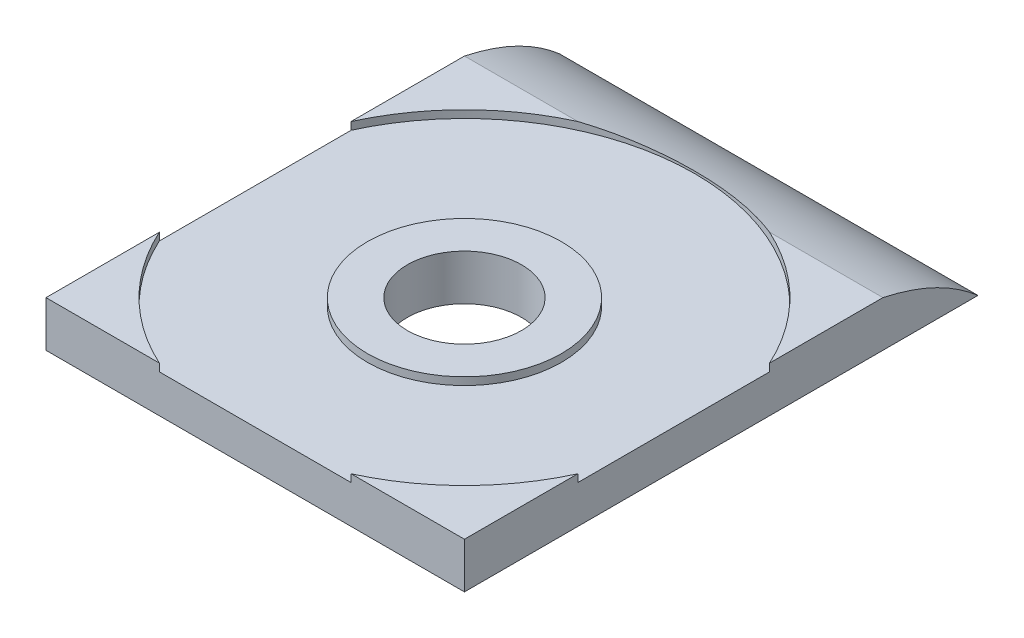
ISO-10303-21;
HEADER;
FILE_DESCRIPTION(('STEP AP214'),'2;1');
FILE_NAME('part.step','',(''),(''),'','','');
FILE_SCHEMA(('AUTOMOTIVE_DESIGN { 1 0 10303 214 1 1 1 1 }'));
ENDSEC;
DATA;
#1=APPLICATION_CONTEXT('core data for automotive mechanical design processes');
#2=APPLICATION_PROTOCOL_DEFINITION('international standard','automotive_design',2000,#1);
#3=PRODUCT_CONTEXT('',#1,'mechanical');
#4=PRODUCT('Part','Part','',(#3));
#5=PRODUCT_RELATED_PRODUCT_CATEGORY('part','',(#4));
#6=PRODUCT_DEFINITION_FORMATION('','',#4);
#7=PRODUCT_DEFINITION_CONTEXT('part definition',#1,'design');
#8=PRODUCT_DEFINITION('design','',#6,#7);
#9=PRODUCT_DEFINITION_SHAPE('','',#8);
#10=(LENGTH_UNIT() NAMED_UNIT(*) SI_UNIT(.MILLI.,.METRE.));
#11=(NAMED_UNIT(*) PLANE_ANGLE_UNIT() SI_UNIT($,.RADIAN.));
#12=(NAMED_UNIT(*) SI_UNIT($,.STERADIAN.) SOLID_ANGLE_UNIT());
#13=UNCERTAINTY_MEASURE_WITH_UNIT(LENGTH_MEASURE(1.E-05),#10,'distance_accuracy_value','');
#14=(GEOMETRIC_REPRESENTATION_CONTEXT(3) GLOBAL_UNCERTAINTY_ASSIGNED_CONTEXT((#13)) GLOBAL_UNIT_ASSIGNED_CONTEXT((#10,
#11,#12)) REPRESENTATION_CONTEXT('',''));
#15=CARTESIAN_POINT('',(0.,0.,0.));
#16=DIRECTION('',(0.,0.,1.));
#17=DIRECTION('',(1.,0.,0.));
#18=AXIS2_PLACEMENT_3D('',#15,#16,#17);
#19=CARTESIAN_POINT('',(0.,1.2,0.));
#20=DIRECTION('',(0.,1.,0.));
#21=DIRECTION('',(0.,0.,1.));
#22=AXIS2_PLACEMENT_3D('',#19,#20,#21);
#23=PLANE('',#22);
#24=CARTESIAN_POINT('',(0.,1.2,0.));
#25=DIRECTION('',(0.,1.,0.));
#26=DIRECTION('',(0.,0.,1.));
#27=AXIS2_PLACEMENT_3D('',#24,#25,#26);
#28=CIRCLE('',#27,6.05);
#29=CARTESIAN_POINT('',(2.52041663222571,1.2,5.5));
#30=VERTEX_POINT('',#29);
#31=CARTESIAN_POINT('',(5.5,1.2,2.52041663222571));
#32=VERTEX_POINT('',#31);
#33=EDGE_CURVE('E188',#30,#32,#28,.T.);
#34=ORIENTED_EDGE('',*,*,#33,.F.);
#35=DIRECTION('',(1.,0.,0.));
#36=VECTOR('',#35,1.);
#37=CARTESIAN_POINT('',(0.,1.2,5.5));
#38=LINE('',#37,#36);
#39=CARTESIAN_POINT('',(5.5,1.2,5.5));
#40=VERTEX_POINT('',#39);
#41=EDGE_CURVE('E112',#30,#40,#38,.T.);
#42=ORIENTED_EDGE('',*,*,#41,.T.);
#43=DIRECTION('',(0.,0.,1.));
#44=VECTOR('',#43,1.);
#45=CARTESIAN_POINT('',(5.5,1.2,0.));
#46=LINE('',#45,#44);
#47=EDGE_CURVE('E230',#32,#40,#46,.T.);
#48=ORIENTED_EDGE('',*,*,#47,.F.);
#49=EDGE_LOOP('',(#34,#42,#48));
#50=FACE_BOUND('',#49,.T.);
#51=ADVANCED_FACE('F35',(#50),#23,.T.);
#52=CARTESIAN_POINT('',(5.5,1.2,-2.52041663222571));
#53=VERTEX_POINT('',#52);
#54=CARTESIAN_POINT('',(2.52041663222571,1.2,-5.5));
#55=VERTEX_POINT('',#54);
#56=EDGE_CURVE('E50',#53,#55,#28,.T.);
#57=ORIENTED_EDGE('',*,*,#56,.F.);
#58=CARTESIAN_POINT('',(5.5,1.2,-5.5));
#59=VERTEX_POINT('',#58);
#60=EDGE_CURVE('E231',#59,#53,#46,.T.);
#61=ORIENTED_EDGE('',*,*,#60,.F.);
#62=DIRECTION('',(1.,0.,0.));
#63=VECTOR('',#62,1.);
#64=CARTESIAN_POINT('',(-5.5,1.2,-5.5));
#65=LINE('',#64,#63);
#66=EDGE_CURVE('E216',#55,#59,#65,.T.);
#67=ORIENTED_EDGE('',*,*,#66,.F.);
#68=EDGE_LOOP('',(#57,#61,#67));
#69=FACE_BOUND('',#68,.T.);
#70=ADVANCED_FACE('F144',(#69),#23,.T.);
#71=CARTESIAN_POINT('',(-2.52041663222571,1.2,-5.5));
#72=VERTEX_POINT('',#71);
#73=CARTESIAN_POINT('',(-5.5,1.2,-2.52041663222571));
#74=VERTEX_POINT('',#73);
#75=EDGE_CURVE('E242',#72,#74,#28,.T.);
#76=ORIENTED_EDGE('',*,*,#75,.F.);
#77=CARTESIAN_POINT('',(-5.5,1.2,-5.5));
#78=VERTEX_POINT('',#77);
#79=EDGE_CURVE('E106',#78,#72,#65,.T.);
#80=ORIENTED_EDGE('',*,*,#79,.F.);
#81=DIRECTION('',(0.,0.,1.));
#82=VECTOR('',#81,1.);
#83=CARTESIAN_POINT('',(-5.5,1.2,0.));
#84=LINE('',#83,#82);
#85=EDGE_CURVE('E233',#78,#74,#84,.T.);
#86=ORIENTED_EDGE('',*,*,#85,.T.);
#87=EDGE_LOOP('',(#76,#80,#86));
#88=FACE_BOUND('',#87,.T.);
#89=ADVANCED_FACE('F150',(#88),#23,.T.);
#90=CARTESIAN_POINT('',(0.,1.2,0.));
#91=DIRECTION('',(0.,1.,0.));
#92=DIRECTION('',(0.,0.,1.));
#93=AXIS2_PLACEMENT_3D('',#90,#91,#92);
#94=CIRCLE('',#93,1.5);
#95=CARTESIAN_POINT('',(0.,1.2,1.5));
#96=VERTEX_POINT('',#95);
#97=EDGE_CURVE('E98',#96,#96,#94,.T.);
#98=ORIENTED_EDGE('',*,*,#97,.F.);
#99=EDGE_LOOP('',(#98));
#100=FACE_BOUND('',#99,.T.);
#101=CARTESIAN_POINT('',(0.,1.2,0.));
#102=DIRECTION('',(0.,1.,0.));
#103=DIRECTION('',(0.,0.,1.));
#104=AXIS2_PLACEMENT_3D('',#101,#102,#103);
#105=CIRCLE('',#104,2.55);
#106=CARTESIAN_POINT('',(0.,1.2,2.55));
#107=VERTEX_POINT('',#106);
#108=EDGE_CURVE('E176',#107,#107,#105,.T.);
#109=ORIENTED_EDGE('',*,*,#108,.T.);
#110=EDGE_LOOP('',(#109));
#111=FACE_BOUND('',#110,.T.);
#112=ADVANCED_FACE('F156',(#100,#111),#23,.T.);
#113=CARTESIAN_POINT('',(0.,1.2,5.5));
#114=DIRECTION('',(0.,0.,-1.));
#115=DIRECTION('',(-1.,0.,0.));
#116=AXIS2_PLACEMENT_3D('',#113,#114,#115);
#117=PLANE('',#116);
#118=DIRECTION('',(1.,0.,0.));
#119=VECTOR('',#118,1.);
#120=CARTESIAN_POINT('',(0.,1.,5.5));
#121=LINE('',#120,#119);
#122=CARTESIAN_POINT('',(-2.52041663222571,1.,5.5));
#123=VERTEX_POINT('',#122);
#124=CARTESIAN_POINT('',(2.52041663222571,1.,5.5));
#125=VERTEX_POINT('',#124);
#126=EDGE_CURVE('E209',#123,#125,#121,.T.);
#127=ORIENTED_EDGE('',*,*,#126,.F.);
#128=DIRECTION('',(0.,1.,0.));
#129=VECTOR('',#128,1.);
#130=CARTESIAN_POINT('',(-2.52041663222571,1.,5.5));
#131=LINE('',#130,#129);
#132=CARTESIAN_POINT('',(-2.52041663222571,1.2,5.5));
#133=VERTEX_POINT('',#132);
#134=EDGE_CURVE('E204',#123,#133,#131,.T.);
#135=ORIENTED_EDGE('',*,*,#134,.T.);
#136=CARTESIAN_POINT('',(-5.5,1.2,5.5));
#137=VERTEX_POINT('',#136);
#138=EDGE_CURVE('E96',#137,#133,#38,.T.);
#139=ORIENTED_EDGE('',*,*,#138,.F.);
#140=DIRECTION('',(0.,-1.,0.));
#141=VECTOR('',#140,1.);
#142=CARTESIAN_POINT('',(-5.5,1.2,5.5));
#143=LINE('',#142,#141);
#144=CARTESIAN_POINT('',(-5.5,0.,5.5));
#145=VERTEX_POINT('',#144);
#146=EDGE_CURVE('E77',#137,#145,#143,.T.);
#147=ORIENTED_EDGE('',*,*,#146,.T.);
#148=DIRECTION('',(1.,0.,0.));
#149=VECTOR('',#148,1.);
#150=CARTESIAN_POINT('',(0.,0.,5.5));
#151=LINE('',#150,#149);
#152=CARTESIAN_POINT('',(5.5,0.,5.5));
#153=VERTEX_POINT('',#152);
#154=EDGE_CURVE('E93',#145,#153,#151,.T.);
#155=ORIENTED_EDGE('',*,*,#154,.T.);
#156=DIRECTION('',(0.,-1.,0.));
#157=VECTOR('',#156,1.);
#158=CARTESIAN_POINT('',(5.5,1.2,5.5));
#159=LINE('',#158,#157);
#160=EDGE_CURVE('E97',#40,#153,#159,.T.);
#161=ORIENTED_EDGE('',*,*,#160,.F.);
#162=ORIENTED_EDGE('',*,*,#41,.F.);
#163=DIRECTION('',(0.,1.,0.));
#164=VECTOR('',#163,1.);
#165=CARTESIAN_POINT('',(2.52041663222571,1.,5.5));
#166=LINE('',#165,#164);
#167=EDGE_CURVE('E201',#30,#125,#166,.F.);
#168=ORIENTED_EDGE('',*,*,#167,.T.);
#169=EDGE_LOOP('',(#127,#135,#139,#147,#155,#161,#162,#168));
#170=FACE_BOUND('',#169,.T.);
#171=ADVANCED_FACE('F37',(#170),#117,.F.);
#172=CARTESIAN_POINT('',(5.5,1.2,0.));
#173=DIRECTION('',(1.,0.,0.));
#174=DIRECTION('',(0.,0.,-1.));
#175=AXIS2_PLACEMENT_3D('',#172,#173,#174);
#176=PLANE('',#175);
#177=DIRECTION('',(0.,1.,0.));
#178=VECTOR('',#177,1.);
#179=CARTESIAN_POINT('',(5.5,1.,-2.52041663222572));
#180=LINE('',#179,#178);
#181=CARTESIAN_POINT('',(5.5,1.,-2.52041663222572));
#182=VERTEX_POINT('',#181);
#183=EDGE_CURVE('E199',#182,#53,#180,.T.);
#184=ORIENTED_EDGE('',*,*,#183,.F.);
#185=DIRECTION('',(0.,0.,1.));
#186=VECTOR('',#185,1.);
#187=CARTESIAN_POINT('',(5.5,1.,0.));
#188=LINE('',#187,#186);
#189=CARTESIAN_POINT('',(5.5,1.,2.52041663222571));
#190=VERTEX_POINT('',#189);
#191=EDGE_CURVE('E206',#182,#190,#188,.T.);
#192=ORIENTED_EDGE('',*,*,#191,.T.);
#193=DIRECTION('',(0.,1.,0.));
#194=VECTOR('',#193,1.);
#195=CARTESIAN_POINT('',(5.5,1.,2.52041663222571));
#196=LINE('',#195,#194);
#197=EDGE_CURVE('E196',#32,#190,#196,.F.);
#198=ORIENTED_EDGE('',*,*,#197,.F.);
#199=ORIENTED_EDGE('',*,*,#47,.T.);
#200=ORIENTED_EDGE('',*,*,#160,.T.);
#201=DIRECTION('',(0.,0.,1.));
#202=VECTOR('',#201,1.);
#203=CARTESIAN_POINT('',(5.5,0.,0.));
#204=LINE('',#203,#202);
#205=CARTESIAN_POINT('',(5.5,0.,-8.));
#206=VERTEX_POINT('',#205);
#207=EDGE_CURVE('E87',#206,#153,#204,.T.);
#208=ORIENTED_EDGE('',*,*,#207,.F.);
#209=CARTESIAN_POINT('',(5.5,1.2,-5.5));
#210=CARTESIAN_POINT('',(5.5,0.568989804767212,-8.44984349973282));
#211=CARTESIAN_POINT('',(5.5,-2.24984925687285,-9.49887521928226));
#212=B_SPLINE_CURVE_WITH_KNOTS('',2,(#209,#210,#211),.UNSPECIFIED.,.F.,.F.,(3,3),(0.,1.),.UNSPECIFIED.);
#213=EDGE_CURVE('E211',#59,#206,#212,.T.);
#214=ORIENTED_EDGE('',*,*,#213,.F.);
#215=ORIENTED_EDGE('',*,*,#60,.T.);
#216=EDGE_LOOP('',(#184,#192,#198,#199,#200,#208,#214,#215));
#217=FACE_BOUND('',#216,.T.);
#218=ADVANCED_FACE('F169',(#217),#176,.T.);
#219=CARTESIAN_POINT('',(-5.5,1.2,0.));
#220=DIRECTION('',(1.,0.,0.));
#221=DIRECTION('',(0.,0.,-1.));
#222=AXIS2_PLACEMENT_3D('',#219,#220,#221);
#223=PLANE('',#222);
#224=DIRECTION('',(0.,0.,1.));
#225=VECTOR('',#224,1.);
#226=CARTESIAN_POINT('',(-5.5,1.,0.));
#227=LINE('',#226,#225);
#228=CARTESIAN_POINT('',(-5.5,1.,-2.52041663222571));
#229=VERTEX_POINT('',#228);
#230=CARTESIAN_POINT('',(-5.5,1.,2.52041663222572));
#231=VERTEX_POINT('',#230);
#232=EDGE_CURVE('E11',#229,#231,#227,.T.);
#233=ORIENTED_EDGE('',*,*,#232,.F.);
#234=DIRECTION('',(0.,1.,0.));
#235=VECTOR('',#234,1.);
#236=CARTESIAN_POINT('',(-5.5,1.,-2.52041663222571));
#237=LINE('',#236,#235);
#238=EDGE_CURVE('E193',#229,#74,#237,.T.);
#239=ORIENTED_EDGE('',*,*,#238,.T.);
#240=ORIENTED_EDGE('',*,*,#85,.F.);
#241=CARTESIAN_POINT('',(-5.5,1.2,-5.5));
#242=CARTESIAN_POINT('',(-5.5,0.568989804767212,-8.44984349973282));
#243=CARTESIAN_POINT('',(-5.5,-2.24984925687285,-9.49887521928225));
#244=B_SPLINE_CURVE_WITH_KNOTS('',2,(#241,#242,#243),.UNSPECIFIED.,.F.,.F.,(3,3),(0.,1.),.UNSPECIFIED.);
#245=CARTESIAN_POINT('',(-5.5,0.,-8.));
#246=VERTEX_POINT('',#245);
#247=EDGE_CURVE('E82',#78,#246,#244,.T.);
#248=ORIENTED_EDGE('',*,*,#247,.T.);
#249=DIRECTION('',(0.,0.,1.));
#250=VECTOR('',#249,1.);
#251=CARTESIAN_POINT('',(-5.5,0.,0.));
#252=LINE('',#251,#250);
#253=EDGE_CURVE('E73',#246,#145,#252,.T.);
#254=ORIENTED_EDGE('',*,*,#253,.T.);
#255=ORIENTED_EDGE('',*,*,#146,.F.);
#256=CARTESIAN_POINT('',(-5.5,1.2,2.52041663222571));
#257=VERTEX_POINT('',#256);
#258=EDGE_CURVE('E59',#257,#137,#84,.T.);
#259=ORIENTED_EDGE('',*,*,#258,.F.);
#260=DIRECTION('',(0.,1.,0.));
#261=VECTOR('',#260,1.);
#262=CARTESIAN_POINT('',(-5.5,1.,2.52041663222572));
#263=LINE('',#262,#261);
#264=EDGE_CURVE('E185',#257,#231,#263,.F.);
#265=ORIENTED_EDGE('',*,*,#264,.T.);
#266=EDGE_LOOP('',(#233,#239,#240,#248,#254,#255,#259,#265));
#267=FACE_BOUND('',#266,.T.);
#268=ADVANCED_FACE('F76',(#267),#223,.F.);
#269=CARTESIAN_POINT('',(0.,1.2,0.));
#270=DIRECTION('',(0.,-1.,0.));
#271=DIRECTION('',(0.,0.,-1.));
#272=AXIS2_PLACEMENT_3D('',#269,#270,#271);
#273=CYLINDRICAL_SURFACE('',#272,1.5);
#274=ORIENTED_EDGE('',*,*,#97,.T.);
#275=EDGE_LOOP('',(#274));
#276=FACE_BOUND('',#275,.T.);
#277=CARTESIAN_POINT('',(0.,0.,0.));
#278=DIRECTION('',(0.,1.,0.));
#279=DIRECTION('',(0.,0.,1.));
#280=AXIS2_PLACEMENT_3D('',#277,#278,#279);
#281=CIRCLE('',#280,1.5);
#282=CARTESIAN_POINT('',(0.,0.,1.5));
#283=VERTEX_POINT('',#282);
#284=EDGE_CURVE('E86',#283,#283,#281,.T.);
#285=ORIENTED_EDGE('',*,*,#284,.F.);
#286=EDGE_LOOP('',(#285));
#287=FACE_BOUND('',#286,.T.);
#288=ADVANCED_FACE('F155',(#276,#287),#273,.F.);
#289=EDGE_CURVE('E179',#257,#133,#28,.T.);
#290=ORIENTED_EDGE('',*,*,#289,.F.);
#291=ORIENTED_EDGE('',*,*,#258,.T.);
#292=ORIENTED_EDGE('',*,*,#138,.T.);
#293=EDGE_LOOP('',(#290,#291,#292));
#294=FACE_BOUND('',#293,.T.);
#295=ADVANCED_FACE('F146',(#294),#23,.T.);
#296=CARTESIAN_POINT('',(0.,0.,0.));
#297=DIRECTION('',(0.,1.,0.));
#298=DIRECTION('',(0.,0.,1.));
#299=AXIS2_PLACEMENT_3D('',#296,#297,#298);
#300=PLANE('',#299);
#301=ORIENTED_EDGE('',*,*,#154,.F.);
#302=ORIENTED_EDGE('',*,*,#253,.F.);
#303=DIRECTION('',(1.,0.,0.));
#304=VECTOR('',#303,1.);
#305=CARTESIAN_POINT('',(0.,0.,-8.));
#306=LINE('',#305,#304);
#307=EDGE_CURVE('E103',#246,#206,#306,.T.);
#308=ORIENTED_EDGE('',*,*,#307,.T.);
#309=ORIENTED_EDGE('',*,*,#207,.T.);
#310=EDGE_LOOP('',(#301,#302,#308,#309));
#311=FACE_BOUND('',#310,.T.);
#312=ORIENTED_EDGE('',*,*,#284,.T.);
#313=EDGE_LOOP('',(#312));
#314=FACE_BOUND('',#313,.T.);
#315=ADVANCED_FACE('F100',(#311,#314),#300,.F.);
#316=DIRECTION('',(1.,0.,0.));
#317=VECTOR('',#316,1.);
#318=SURFACE_OF_LINEAR_EXTRUSION('',#244,#317);
#319=ORIENTED_EDGE('',*,*,#79,.T.);
#320=CARTESIAN_POINT('',(-2.52041663222571,1.2,-5.5));
#321=CARTESIAN_POINT('',(-2.41949712430106,1.19010452777864,-5.54624976403804));
#322=CARTESIAN_POINT('',(-2.31729159886211,1.18032850151475,-5.58972262669964));
#323=CARTESIAN_POINT('',(-2.11057372436044,1.16132793427133,-5.67100597656389));
#324=CARTESIAN_POINT('',(-2.00606080731155,1.15210353119899,-5.70881505133136));
#325=CARTESIAN_POINT('',(-1.79503581594945,1.13452337111909,-5.77864178040282));
#326=CARTESIAN_POINT('',(-1.68852358904154,1.12616768073574,-5.81065899065023));
#327=CARTESIAN_POINT('',(-1.473908971256,1.11061986896174,-5.86876823464539));
#328=CARTESIAN_POINT('',(-1.36580801692337,1.10342675941684,-5.89486530800499));
#329=CARTESIAN_POINT('',(-1.14825922558485,1.09044951681246,-5.94107427871985));
#330=CARTESIAN_POINT('',(-1.03881152703608,1.0846652401632,-5.96118678607492));
#331=CARTESIAN_POINT('',(-0.818914418929136,1.07471079989669,-5.99535344550056));
#332=CARTESIAN_POINT('',(-0.708465066226584,1.07054054524441,-6.00940793926394));
#333=CARTESIAN_POINT('',(-0.431133085455715,1.06231729543087,-6.03693771981346));
#334=CARTESIAN_POINT('',(-0.263817529059458,1.05937905055139,-6.04656351052843));
#335=CARTESIAN_POINT('',(0.0710570363799489,1.0577558610928,-6.05190099513102));
#336=CARTESIAN_POINT('',(0.238616068554974,1.05907135120317,-6.04761126699063));
#337=CARTESIAN_POINT('',(0.572579583942088,1.06584216628936,-6.02516644344654));
#338=CARTESIAN_POINT('',(0.738984934931198,1.07129393581031,-6.00702325608615));
#339=CARTESIAN_POINT('',(1.06949833143811,1.08588083040505,-5.95706418381672));
#340=CARTESIAN_POINT('',(1.23360698579495,1.09501495941056,-5.92525199618221));
#341=CARTESIAN_POINT('',(1.58953000652975,1.11827105678085,-5.84083933792996));
#342=CARTESIAN_POINT('',(1.78064900555196,1.133012493604,-5.78542876902788));
#343=CARTESIAN_POINT('',(2.06220349837978,1.15704170319823,-5.6885561151831));
#344=CARTESIAN_POINT('',(2.1551579162263,1.16536652567951,-5.65399217359373));
#345=CARTESIAN_POINT('',(2.33921529091644,1.1824295763536,-5.58035736149008));
#346=CARTESIAN_POINT('',(2.43031842437998,1.19116776484242,-5.54128692331049));
#347=CARTESIAN_POINT('',(2.52041663222571,1.2,-5.5));
#348=B_SPLINE_CURVE_WITH_KNOTS('',3,(#320,#321,#322,#323,#324,#325,#326,#327,#328,#329,#330,
#331,#332,#333,#334,#335,#336,#337,#338,#339,#340,#341,#342,#343,#344,#345,#346,#347),
.UNSPECIFIED.,.F.,.F.,(4,2,2,2,2,2,2,2,2,2,2,2,2,4),(0.,0.334318702447089,0.668720638977016,
1.00314820292002,1.33729000269418,1.67139773210907,2.00548661423103,2.50767307824986,
3.0099108623617,3.51171742233817,4.01338833597667,4.61088284699556,4.90934577283113,
5.20778008914399),.UNSPECIFIED.);
#349=EDGE_CURVE('E43',#72,#55,#348,.T.);
#350=ORIENTED_EDGE('',*,*,#349,.T.);
#351=ORIENTED_EDGE('',*,*,#66,.T.);
#352=ORIENTED_EDGE('',*,*,#213,.T.);
#353=ORIENTED_EDGE('',*,*,#307,.F.);
#354=ORIENTED_EDGE('',*,*,#247,.F.);
#355=EDGE_LOOP('',(#319,#350,#351,#352,#353,#354));
#356=FACE_BOUND('',#355,.T.);
#357=ADVANCED_FACE('F120',(#356),#318,.F.);
#358=CARTESIAN_POINT('',(0.,1.,0.));
#359=DIRECTION('',(0.,1.,0.));
#360=DIRECTION('',(0.,0.,1.));
#361=AXIS2_PLACEMENT_3D('',#358,#359,#360);
#362=PLANE('',#361);
#363=CARTESIAN_POINT('',(0.,1.,0.));
#364=DIRECTION('',(0.,1.,0.));
#365=DIRECTION('',(0.,0.,1.));
#366=AXIS2_PLACEMENT_3D('',#363,#364,#365);
#367=CIRCLE('',#366,2.55);
#368=CARTESIAN_POINT('',(0.,1.,2.55));
#369=VERTEX_POINT('',#368);
#370=EDGE_CURVE('E177',#369,#369,#367,.T.);
#371=ORIENTED_EDGE('',*,*,#370,.F.);
#372=EDGE_LOOP('',(#371));
#373=FACE_BOUND('',#372,.T.);
#374=ORIENTED_EDGE('',*,*,#126,.T.);
#375=CARTESIAN_POINT('',(0.,1.,0.));
#376=DIRECTION('',(0.,1.,0.));
#377=DIRECTION('',(0.,0.,1.));
#378=AXIS2_PLACEMENT_3D('',#375,#376,#377);
#379=CIRCLE('',#378,6.05);
#380=EDGE_CURVE('E182',#125,#190,#379,.T.);
#381=ORIENTED_EDGE('',*,*,#380,.T.);
#382=ORIENTED_EDGE('',*,*,#191,.F.);
#383=EDGE_CURVE('E186',#182,#229,#379,.T.);
#384=ORIENTED_EDGE('',*,*,#383,.T.);
#385=ORIENTED_EDGE('',*,*,#232,.T.);
#386=EDGE_CURVE('E187',#231,#123,#379,.T.);
#387=ORIENTED_EDGE('',*,*,#386,.T.);
#388=EDGE_LOOP('',(#374,#381,#382,#384,#385,#387));
#389=FACE_BOUND('',#388,.T.);
#390=ADVANCED_FACE('F129',(#373,#389),#362,.T.);
#391=CARTESIAN_POINT('',(0.,1.,0.));
#392=DIRECTION('',(0.,1.,0.));
#393=DIRECTION('',(0.,0.,1.));
#394=AXIS2_PLACEMENT_3D('',#391,#392,#393);
#395=CYLINDRICAL_SURFACE('',#394,6.05);
#396=ORIENTED_EDGE('',*,*,#386,.F.);
#397=ORIENTED_EDGE('',*,*,#264,.F.);
#398=ORIENTED_EDGE('',*,*,#289,.T.);
#399=ORIENTED_EDGE('',*,*,#134,.F.);
#400=EDGE_LOOP('',(#396,#397,#398,#399));
#401=FACE_BOUND('',#400,.T.);
#402=ADVANCED_FACE('F124',(#401),#395,.F.);
#403=ORIENTED_EDGE('',*,*,#33,.T.);
#404=ORIENTED_EDGE('',*,*,#197,.T.);
#405=ORIENTED_EDGE('',*,*,#380,.F.);
#406=ORIENTED_EDGE('',*,*,#167,.F.);
#407=EDGE_LOOP('',(#403,#404,#405,#406));
#408=FACE_BOUND('',#407,.T.);
#409=ADVANCED_FACE('F128',(#408),#395,.F.);
#410=ORIENTED_EDGE('',*,*,#183,.T.);
#411=ORIENTED_EDGE('',*,*,#56,.T.);
#412=ORIENTED_EDGE('',*,*,#349,.F.);
#413=ORIENTED_EDGE('',*,*,#75,.T.);
#414=ORIENTED_EDGE('',*,*,#238,.F.);
#415=ORIENTED_EDGE('',*,*,#383,.F.);
#416=EDGE_LOOP('',(#410,#411,#412,#413,#414,#415));
#417=FACE_BOUND('',#416,.T.);
#418=ADVANCED_FACE('F131',(#417),#395,.F.);
#419=CARTESIAN_POINT('',(0.,1.,0.));
#420=DIRECTION('',(0.,1.,0.));
#421=DIRECTION('',(0.,0.,1.));
#422=AXIS2_PLACEMENT_3D('',#419,#420,#421);
#423=CYLINDRICAL_SURFACE('',#422,2.55);
#424=ORIENTED_EDGE('',*,*,#370,.T.);
#425=EDGE_LOOP('',(#424));
#426=FACE_BOUND('',#425,.T.);
#427=ORIENTED_EDGE('',*,*,#108,.F.);
#428=EDGE_LOOP('',(#427));
#429=FACE_BOUND('',#428,.T.);
#430=ADVANCED_FACE('F135',(#426,#429),#423,.T.);
#431=CLOSED_SHELL('',(#51,#70,#89,#112,#171,#218,#268,#288,#295,#315,#357,#390,#402,#409,#418,#430));
#432=MANIFOLD_SOLID_BREP('B2',#431);
#433=ADVANCED_BREP_SHAPE_REPRESENTATION('',(#18,#432),#14);
#434=SHAPE_DEFINITION_REPRESENTATION(#9,#433);
ENDSEC;
END-ISO-10303-21;
